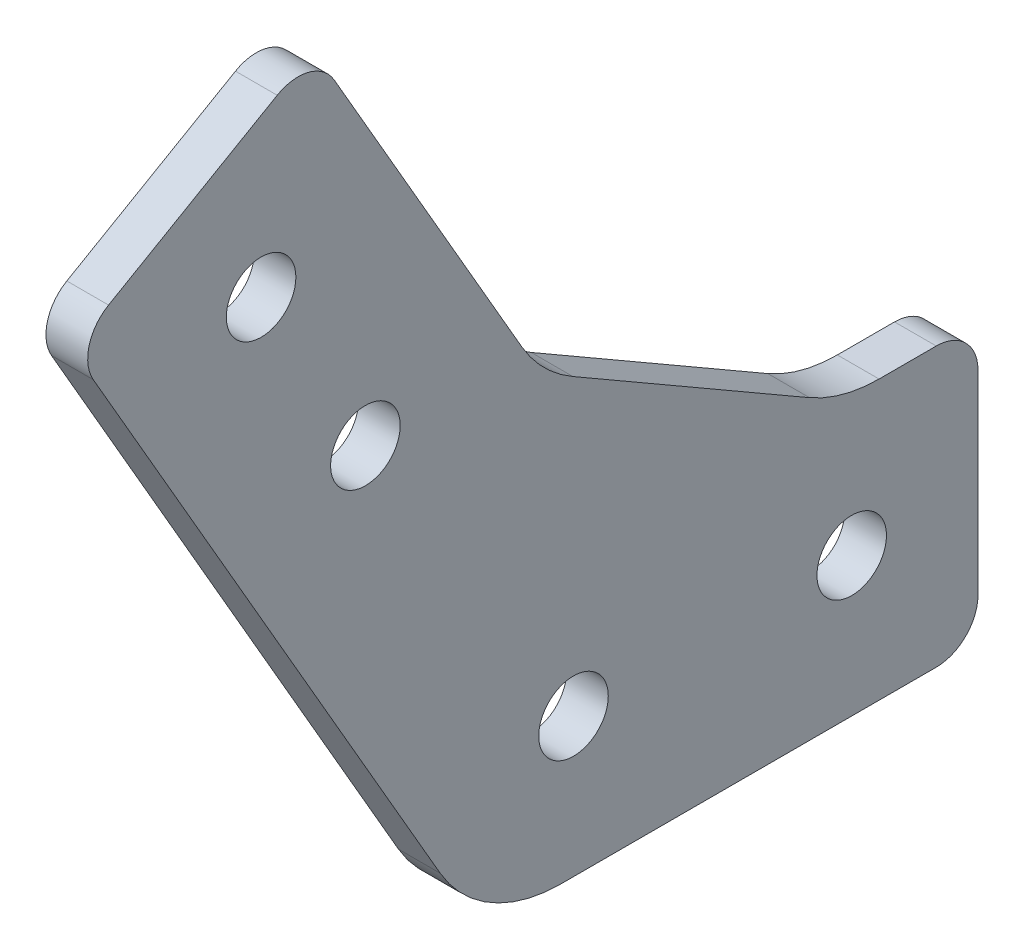
ISO-10303-21;
HEADER;
FILE_DESCRIPTION(('STEP AP214'),'2;1');
FILE_NAME('part.step','',(''),(''),'','','');
FILE_SCHEMA(('AUTOMOTIVE_DESIGN { 1 0 10303 214 1 1 1 1 }'));
ENDSEC;
DATA;
#1=APPLICATION_CONTEXT('core data for automotive mechanical design processes');
#2=APPLICATION_PROTOCOL_DEFINITION('international standard','automotive_design',2000,#1);
#3=PRODUCT_CONTEXT('',#1,'mechanical');
#4=PRODUCT('Part','Part','',(#3));
#5=PRODUCT_RELATED_PRODUCT_CATEGORY('part','',(#4));
#6=PRODUCT_DEFINITION_FORMATION('','',#4);
#7=PRODUCT_DEFINITION_CONTEXT('part definition',#1,'design');
#8=PRODUCT_DEFINITION('design','',#6,#7);
#9=PRODUCT_DEFINITION_SHAPE('','',#8);
#10=(LENGTH_UNIT() NAMED_UNIT(*) SI_UNIT(.MILLI.,.METRE.));
#11=(NAMED_UNIT(*) PLANE_ANGLE_UNIT() SI_UNIT($,.RADIAN.));
#12=(NAMED_UNIT(*) SI_UNIT($,.STERADIAN.) SOLID_ANGLE_UNIT());
#13=UNCERTAINTY_MEASURE_WITH_UNIT(LENGTH_MEASURE(1.E-05),#10,'distance_accuracy_value','');
#14=(GEOMETRIC_REPRESENTATION_CONTEXT(3) GLOBAL_UNCERTAINTY_ASSIGNED_CONTEXT((#13)) GLOBAL_UNIT_ASSIGNED_CONTEXT((#10,
#11,#12)) REPRESENTATION_CONTEXT('',''));
#15=CARTESIAN_POINT('',(0.,0.,0.));
#16=DIRECTION('',(0.,0.,1.));
#17=DIRECTION('',(1.,0.,0.));
#18=AXIS2_PLACEMENT_3D('',#15,#16,#17);
#19=CARTESIAN_POINT('',(3.,40.8012701892218,35.1036297108187));
#20=DIRECTION('',(0.,-0.866025403784436,-0.500000000000004));
#21=DIRECTION('',(0.,0.500000000000004,-0.866025403784436));
#22=AXIS2_PLACEMENT_3D('',#19,#20,#21);
#23=PLANE('',#22);
#24=DIRECTION('',(0.,-0.500000000000004,0.866025403784436));
#25=VECTOR('',#24,1.);
#26=CARTESIAN_POINT('',(0.,40.8012701892218,35.1036297108187));
#27=LINE('',#26,#25);
#28=CARTESIAN_POINT('',(0.,49.3012701892218,20.3811978464832));
#29=VERTEX_POINT('',#28);
#30=CARTESIAN_POINT('',(0.,42.3012701892218,32.5055534994654));
#31=VERTEX_POINT('',#30);
#32=EDGE_CURVE('E182',#29,#31,#27,.T.);
#33=ORIENTED_EDGE('',*,*,#32,.T.);
#34=DIRECTION('',(-1.,0.,0.));
#35=VECTOR('',#34,1.);
#36=CARTESIAN_POINT('',(3.,42.3012701892218,32.5055534994654));
#37=LINE('',#36,#35);
#38=CARTESIAN_POINT('',(3.,42.3012701892218,32.5055534994654));
#39=VERTEX_POINT('',#38);
#40=EDGE_CURVE('E229',#31,#39,#37,.F.);
#41=ORIENTED_EDGE('',*,*,#40,.T.);
#42=DIRECTION('',(0.,-0.500000000000004,0.866025403784436));
#43=VECTOR('',#42,1.);
#44=CARTESIAN_POINT('',(3.,40.8012701892218,35.1036297108187));
#45=LINE('',#44,#43);
#46=CARTESIAN_POINT('',(3.,49.3012701892218,20.3811978464832));
#47=VERTEX_POINT('',#46);
#48=EDGE_CURVE('E149',#47,#39,#45,.T.);
#49=ORIENTED_EDGE('',*,*,#48,.F.);
#50=DIRECTION('',(-1.,0.,0.));
#51=VECTOR('',#50,1.);
#52=CARTESIAN_POINT('',(3.,49.3012701892218,20.3811978464832));
#53=LINE('',#52,#51);
#54=EDGE_CURVE('E226',#47,#29,#53,.T.);
#55=ORIENTED_EDGE('',*,*,#54,.T.);
#56=EDGE_LOOP('',(#33,#41,#49,#55));
#57=FACE_BOUND('',#56,.T.);
#58=ADVANCED_FACE('F36',(#57),#23,.F.);
#59=CARTESIAN_POINT('',(3.,-5.,8.66025403784439));
#60=DIRECTION('',(0.,0.500000000000004,-0.866025403784436));
#61=DIRECTION('',(0.,0.866025403784436,0.500000000000004));
#62=AXIS2_PLACEMENT_3D('',#59,#60,#61);
#63=PLANE('',#62);
#64=DIRECTION('',(0.,-0.866025403784436,-0.500000000000004));
#65=VECTOR('',#64,1.);
#66=CARTESIAN_POINT('',(3.,-5.,8.66025403784439));
#67=LINE('',#66,#65);
#68=CARTESIAN_POINT('',(3.,38.2031939778685,33.6036297108187));
#69=VERTEX_POINT('',#68);
#70=CARTESIAN_POINT('',(3.,-5.,8.66025403784439));
#71=VERTEX_POINT('',#70);
#72=EDGE_CURVE('E136',#69,#71,#67,.T.);
#73=ORIENTED_EDGE('',*,*,#72,.F.);
#74=DIRECTION('',(-1.,0.,0.));
#75=VECTOR('',#74,1.);
#76=CARTESIAN_POINT('',(3.,38.2031939778685,33.6036297108187));
#77=LINE('',#76,#75);
#78=CARTESIAN_POINT('',(0.,38.2031939778685,33.6036297108187));
#79=VERTEX_POINT('',#78);
#80=EDGE_CURVE('E158',#69,#79,#77,.T.);
#81=ORIENTED_EDGE('',*,*,#80,.T.);
#82=DIRECTION('',(0.,-0.866025403784436,-0.500000000000004));
#83=VECTOR('',#82,1.);
#84=CARTESIAN_POINT('',(0.,-5.,8.66025403784439));
#85=LINE('',#84,#83);
#86=CARTESIAN_POINT('',(0.,-5.,8.66025403784439));
#87=VERTEX_POINT('',#86);
#88=EDGE_CURVE('E155',#79,#87,#85,.T.);
#89=ORIENTED_EDGE('',*,*,#88,.T.);
#90=DIRECTION('',(-1.,0.,0.));
#91=VECTOR('',#90,1.);
#92=CARTESIAN_POINT('',(3.,-5.,8.66025403784439));
#93=LINE('',#92,#91);
#94=EDGE_CURVE('E152',#71,#87,#93,.T.);
#95=ORIENTED_EDGE('',*,*,#94,.F.);
#96=EDGE_LOOP('',(#73,#81,#89,#95));
#97=FACE_BOUND('',#96,.T.);
#98=ADVANCED_FACE('F153',(#97),#63,.F.);
#99=CARTESIAN_POINT('',(3.,0.,0.));
#100=DIRECTION('',(-1.,0.,0.));
#101=DIRECTION('',(0.,0.,1.));
#102=AXIS2_PLACEMENT_3D('',#99,#100,#101);
#103=CYLINDRICAL_SURFACE('',#102,10.);
#104=CARTESIAN_POINT('',(0.,0.,0.));
#105=DIRECTION('',(1.,0.,0.));
#106=DIRECTION('',(0.,0.,1.));
#107=AXIS2_PLACEMENT_3D('',#104,#105,#106);
#108=CIRCLE('',#107,10.);
#109=CARTESIAN_POINT('',(0.,-10.,0.));
#110=VERTEX_POINT('',#109);
#111=EDGE_CURVE('E187',#87,#110,#108,.T.);
#112=ORIENTED_EDGE('',*,*,#111,.T.);
#113=DIRECTION('',(-1.,0.,0.));
#114=VECTOR('',#113,1.);
#115=CARTESIAN_POINT('',(3.,-10.,0.));
#116=LINE('',#115,#114);
#117=CARTESIAN_POINT('',(3.,-10.,0.));
#118=VERTEX_POINT('',#117);
#119=EDGE_CURVE('E159',#118,#110,#116,.T.);
#120=ORIENTED_EDGE('',*,*,#119,.F.);
#121=CARTESIAN_POINT('',(3.,0.,0.));
#122=DIRECTION('',(1.,0.,0.));
#123=DIRECTION('',(0.,0.,1.));
#124=AXIS2_PLACEMENT_3D('',#121,#122,#123);
#125=CIRCLE('',#124,10.);
#126=EDGE_CURVE('E142',#71,#118,#125,.T.);
#127=ORIENTED_EDGE('',*,*,#126,.F.);
#128=ORIENTED_EDGE('',*,*,#94,.T.);
#129=EDGE_LOOP('',(#112,#120,#127,#128));
#130=FACE_BOUND('',#129,.T.);
#131=ADVANCED_FACE('F161',(#130),#103,.T.);
#132=CARTESIAN_POINT('',(3.,-10.,0.));
#133=DIRECTION('',(0.,1.,0.));
#134=DIRECTION('',(0.,0.,1.));
#135=AXIS2_PLACEMENT_3D('',#132,#133,#134);
#136=PLANE('',#135);
#137=DIRECTION('',(0.,0.,-1.));
#138=VECTOR('',#137,1.);
#139=CARTESIAN_POINT('',(0.,-10.,0.));
#140=LINE('',#139,#138);
#141=CARTESIAN_POINT('',(0.,-10.,-27.));
#142=VERTEX_POINT('',#141);
#143=EDGE_CURVE('E189',#110,#142,#140,.T.);
#144=ORIENTED_EDGE('',*,*,#143,.T.);
#145=DIRECTION('',(-1.,0.,0.));
#146=VECTOR('',#145,1.);
#147=CARTESIAN_POINT('',(3.,-10.,-27.));
#148=LINE('',#147,#146);
#149=CARTESIAN_POINT('',(3.,-10.,-27.));
#150=VERTEX_POINT('',#149);
#151=EDGE_CURVE('E242',#142,#150,#148,.F.);
#152=ORIENTED_EDGE('',*,*,#151,.T.);
#153=DIRECTION('',(0.,0.,-1.));
#154=VECTOR('',#153,1.);
#155=CARTESIAN_POINT('',(3.,-10.,0.));
#156=LINE('',#155,#154);
#157=EDGE_CURVE('E164',#118,#150,#156,.T.);
#158=ORIENTED_EDGE('',*,*,#157,.F.);
#159=ORIENTED_EDGE('',*,*,#119,.T.);
#160=EDGE_LOOP('',(#144,#152,#158,#159));
#161=FACE_BOUND('',#160,.T.);
#162=ADVANCED_FACE('F315',(#161),#136,.F.);
#163=CARTESIAN_POINT('',(3.,10.,-30.));
#164=DIRECTION('',(0.,0.,1.));
#165=DIRECTION('',(0.,-1.,0.));
#166=AXIS2_PLACEMENT_3D('',#163,#164,#165);
#167=PLANE('',#166);
#168=DIRECTION('',(0.,1.,0.));
#169=VECTOR('',#168,1.);
#170=CARTESIAN_POINT('',(3.,10.,-30.));
#171=LINE('',#170,#169);
#172=CARTESIAN_POINT('',(3.,-7.,-30.));
#173=VERTEX_POINT('',#172);
#174=CARTESIAN_POINT('',(3.,7.,-30.));
#175=VERTEX_POINT('',#174);
#176=EDGE_CURVE('E166',#173,#175,#171,.T.);
#177=ORIENTED_EDGE('',*,*,#176,.F.);
#178=DIRECTION('',(-1.,0.,0.));
#179=VECTOR('',#178,1.);
#180=CARTESIAN_POINT('',(3.,-7.,-30.));
#181=LINE('',#180,#179);
#182=CARTESIAN_POINT('',(0.,-7.,-30.));
#183=VERTEX_POINT('',#182);
#184=EDGE_CURVE('E239',#173,#183,#181,.T.);
#185=ORIENTED_EDGE('',*,*,#184,.T.);
#186=DIRECTION('',(0.,1.,0.));
#187=VECTOR('',#186,1.);
#188=CARTESIAN_POINT('',(0.,10.,-30.));
#189=LINE('',#188,#187);
#190=CARTESIAN_POINT('',(0.,7.,-30.));
#191=VERTEX_POINT('',#190);
#192=EDGE_CURVE('E192',#183,#191,#189,.T.);
#193=ORIENTED_EDGE('',*,*,#192,.T.);
#194=DIRECTION('',(-1.,0.,0.));
#195=VECTOR('',#194,1.);
#196=CARTESIAN_POINT('',(3.,7.,-30.));
#197=LINE('',#196,#195);
#198=EDGE_CURVE('E237',#191,#175,#197,.F.);
#199=ORIENTED_EDGE('',*,*,#198,.T.);
#200=EDGE_LOOP('',(#177,#185,#193,#199));
#201=FACE_BOUND('',#200,.T.);
#202=ADVANCED_FACE('F309',(#201),#167,.F.);
#203=CARTESIAN_POINT('',(3.,10.,-22.886751345948));
#204=DIRECTION('',(0.,-1.,0.));
#205=DIRECTION('',(0.,0.,-1.));
#206=AXIS2_PLACEMENT_3D('',#203,#204,#205);
#207=PLANE('',#206);
#208=DIRECTION('',(0.,0.,1.));
#209=VECTOR('',#208,1.);
#210=CARTESIAN_POINT('',(3.,10.,-22.886751345948));
#211=LINE('',#210,#209);
#212=CARTESIAN_POINT('',(3.,10.,-27.));
#213=VERTEX_POINT('',#212);
#214=CARTESIAN_POINT('',(3.,10.,-22.886751345948));
#215=VERTEX_POINT('',#214);
#216=EDGE_CURVE('E171',#213,#215,#211,.T.);
#217=ORIENTED_EDGE('',*,*,#216,.F.);
#218=DIRECTION('',(-1.,0.,0.));
#219=VECTOR('',#218,1.);
#220=CARTESIAN_POINT('',(3.,10.,-27.));
#221=LINE('',#220,#219);
#222=CARTESIAN_POINT('',(0.,10.,-27.));
#223=VERTEX_POINT('',#222);
#224=EDGE_CURVE('E44',#213,#223,#221,.T.);
#225=ORIENTED_EDGE('',*,*,#224,.T.);
#226=DIRECTION('',(0.,0.,1.));
#227=VECTOR('',#226,1.);
#228=CARTESIAN_POINT('',(0.,10.,-22.886751345948));
#229=LINE('',#228,#227);
#230=CARTESIAN_POINT('',(0.,10.,-22.886751345948));
#231=VERTEX_POINT('',#230);
#232=EDGE_CURVE('E195',#223,#231,#229,.T.);
#233=ORIENTED_EDGE('',*,*,#232,.T.);
#234=DIRECTION('',(-1.,0.,0.));
#235=VECTOR('',#234,1.);
#236=CARTESIAN_POINT('',(3.,10.,-22.886751345948));
#237=LINE('',#236,#235);
#238=EDGE_CURVE('E213',#215,#231,#237,.T.);
#239=ORIENTED_EDGE('',*,*,#238,.F.);
#240=EDGE_LOOP('',(#217,#225,#233,#239));
#241=FACE_BOUND('',#240,.T.);
#242=ADVANCED_FACE('F247',(#241),#207,.F.);
#243=CARTESIAN_POINT('',(3.,20.,-22.886751345948));
#244=DIRECTION('',(-1.,0.,0.));
#245=DIRECTION('',(0.,0.,1.));
#246=AXIS2_PLACEMENT_3D('',#243,#244,#245);
#247=CYLINDRICAL_SURFACE('',#246,10.);
#248=CARTESIAN_POINT('',(0.,20.,-22.886751345948));
#249=DIRECTION('',(-1.,0.,0.));
#250=DIRECTION('',(0.,0.,1.));
#251=AXIS2_PLACEMENT_3D('',#248,#249,#250);
#252=CIRCLE('',#251,10.);
#253=CARTESIAN_POINT('',(0.,11.3397459621556,-17.8867513459479));
#254=VERTEX_POINT('',#253);
#255=EDGE_CURVE('E197',#231,#254,#252,.T.);
#256=ORIENTED_EDGE('',*,*,#255,.T.);
#257=DIRECTION('',(-1.,0.,0.));
#258=VECTOR('',#257,1.);
#259=CARTESIAN_POINT('',(3.,11.3397459621556,-17.8867513459479));
#260=LINE('',#259,#258);
#261=CARTESIAN_POINT('',(3.,11.3397459621556,-17.8867513459479));
#262=VERTEX_POINT('',#261);
#263=EDGE_CURVE('E210',#262,#254,#260,.T.);
#264=ORIENTED_EDGE('',*,*,#263,.F.);
#265=CARTESIAN_POINT('',(3.,20.,-22.886751345948));
#266=DIRECTION('',(-1.,0.,0.));
#267=DIRECTION('',(0.,0.,1.));
#268=AXIS2_PLACEMENT_3D('',#265,#266,#267);
#269=CIRCLE('',#268,10.);
#270=EDGE_CURVE('E173',#215,#262,#269,.T.);
#271=ORIENTED_EDGE('',*,*,#270,.F.);
#272=ORIENTED_EDGE('',*,*,#238,.T.);
#273=EDGE_LOOP('',(#256,#264,#271,#272));
#274=FACE_BOUND('',#273,.T.);
#275=ADVANCED_FACE('F258',(#274),#247,.F.);
#276=CARTESIAN_POINT('',(3.,21.1602540378444,-0.877132402714575));
#277=DIRECTION('',(0.,-0.866025403784438,0.500000000000001));
#278=DIRECTION('',(0.,-0.500000000000001,-0.866025403784438));
#279=AXIS2_PLACEMENT_3D('',#276,#277,#278);
#280=PLANE('',#279);
#281=DIRECTION('',(0.,0.500000000000001,0.866025403784438));
#282=VECTOR('',#281,1.);
#283=CARTESIAN_POINT('',(0.,21.1602540378444,-0.877132402714575));
#284=LINE('',#283,#282);
#285=CARTESIAN_POINT('',(0.,21.1602540378444,-0.877132402714575));
#286=VERTEX_POINT('',#285);
#287=EDGE_CURVE('E199',#254,#286,#284,.T.);
#288=ORIENTED_EDGE('',*,*,#287,.T.);
#289=DIRECTION('',(-1.,0.,0.));
#290=VECTOR('',#289,1.);
#291=CARTESIAN_POINT('',(3.,21.1602540378444,-0.877132402714575));
#292=LINE('',#291,#290);
#293=CARTESIAN_POINT('',(3.,21.1602540378444,-0.877132402714575));
#294=VERTEX_POINT('',#293);
#295=EDGE_CURVE('E207',#294,#286,#292,.T.);
#296=ORIENTED_EDGE('',*,*,#295,.F.);
#297=DIRECTION('',(0.,0.500000000000001,0.866025403784438));
#298=VECTOR('',#297,1.);
#299=CARTESIAN_POINT('',(3.,21.1602540378444,-0.877132402714575));
#300=LINE('',#299,#298);
#301=EDGE_CURVE('E175',#262,#294,#300,.T.);
#302=ORIENTED_EDGE('',*,*,#301,.F.);
#303=ORIENTED_EDGE('',*,*,#263,.T.);
#304=EDGE_LOOP('',(#288,#296,#302,#303));
#305=FACE_BOUND('',#304,.T.);
#306=ADVANCED_FACE('F262',(#305),#280,.F.);
#307=CARTESIAN_POINT('',(3.,29.8205080756888,-5.87713240271456));
#308=DIRECTION('',(-1.,0.,0.));
#309=DIRECTION('',(0.,0.,1.));
#310=AXIS2_PLACEMENT_3D('',#307,#308,#309);
#311=CYLINDRICAL_SURFACE('',#310,10.);
#312=CARTESIAN_POINT('',(0.,29.8205080756888,-5.87713240271456));
#313=DIRECTION('',(-1.,0.,0.));
#314=DIRECTION('',(0.,0.,1.));
#315=AXIS2_PLACEMENT_3D('',#312,#313,#314);
#316=CIRCLE('',#315,10.);
#317=CARTESIAN_POINT('',(0.,24.8205080756888,2.78312163512982));
#318=VERTEX_POINT('',#317);
#319=EDGE_CURVE('E201',#286,#318,#316,.T.);
#320=ORIENTED_EDGE('',*,*,#319,.T.);
#321=DIRECTION('',(-1.,0.,0.));
#322=VECTOR('',#321,1.);
#323=CARTESIAN_POINT('',(3.,24.8205080756888,2.78312163512982));
#324=LINE('',#323,#322);
#325=CARTESIAN_POINT('',(3.,24.8205080756888,2.78312163512982));
#326=VERTEX_POINT('',#325);
#327=EDGE_CURVE('E181',#326,#318,#324,.T.);
#328=ORIENTED_EDGE('',*,*,#327,.F.);
#329=CARTESIAN_POINT('',(3.,29.8205080756888,-5.87713240271456));
#330=DIRECTION('',(-1.,0.,0.));
#331=DIRECTION('',(0.,0.,1.));
#332=AXIS2_PLACEMENT_3D('',#329,#330,#331);
#333=CIRCLE('',#332,10.);
#334=EDGE_CURVE('E177',#294,#326,#333,.T.);
#335=ORIENTED_EDGE('',*,*,#334,.F.);
#336=ORIENTED_EDGE('',*,*,#295,.T.);
#337=EDGE_LOOP('',(#320,#328,#335,#336));
#338=FACE_BOUND('',#337,.T.);
#339=ADVANCED_FACE('F268',(#338),#311,.F.);
#340=CARTESIAN_POINT('',(3.,24.8205080756888,2.78312163512983));
#341=DIRECTION('',(0.,-0.500000000000004,0.866025403784436));
#342=DIRECTION('',(0.,-0.866025403784436,-0.500000000000004));
#343=AXIS2_PLACEMENT_3D('',#340,#341,#342);
#344=PLANE('',#343);
#345=DIRECTION('',(0.,0.866025403784436,0.500000000000004));
#346=VECTOR('',#345,1.);
#347=CARTESIAN_POINT('',(0.,24.8205080756888,2.78312163512983));
#348=LINE('',#347,#346);
#349=CARTESIAN_POINT('',(0.,48.2031939778686,16.2831216351299));
#350=VERTEX_POINT('',#349);
#351=EDGE_CURVE('E203',#318,#350,#348,.T.);
#352=ORIENTED_EDGE('',*,*,#351,.T.);
#353=DIRECTION('',(-1.,0.,0.));
#354=VECTOR('',#353,1.);
#355=CARTESIAN_POINT('',(3.,48.2031939778686,16.2831216351299));
#356=LINE('',#355,#354);
#357=CARTESIAN_POINT('',(3.,48.2031939778686,16.2831216351299));
#358=VERTEX_POINT('',#357);
#359=EDGE_CURVE('E11',#350,#358,#356,.F.);
#360=ORIENTED_EDGE('',*,*,#359,.T.);
#361=DIRECTION('',(0.,0.866025403784436,0.500000000000004));
#362=VECTOR('',#361,1.);
#363=CARTESIAN_POINT('',(3.,24.8205080756888,2.78312163512983));
#364=LINE('',#363,#362);
#365=EDGE_CURVE('E179',#326,#358,#364,.T.);
#366=ORIENTED_EDGE('',*,*,#365,.F.);
#367=ORIENTED_EDGE('',*,*,#327,.T.);
#368=EDGE_LOOP('',(#352,#360,#366,#367));
#369=FACE_BOUND('',#368,.T.);
#370=ADVANCED_FACE('F270',(#369),#344,.F.);
#371=CARTESIAN_POINT('',(3.,29.8205080756888,-5.87713240271456));
#372=DIRECTION('',(-1.,0.,0.));
#373=DIRECTION('',(0.,0.,1.));
#374=AXIS2_PLACEMENT_3D('',#371,#372,#373);
#375=PLANE('',#374);
#376=CARTESIAN_POINT('',(3.,0.,-20.92));
#377=DIRECTION('',(1.,0.,0.));
#378=DIRECTION('',(0.,0.,-1.));
#379=AXIS2_PLACEMENT_3D('',#376,#377,#378);
#380=CIRCLE('',#379,2.5);
#381=CARTESIAN_POINT('',(3.,0.,-23.42));
#382=VERTEX_POINT('',#381);
#383=EDGE_CURVE('E422',#382,#382,#380,.T.);
#384=ORIENTED_EDGE('',*,*,#383,.F.);
#385=EDGE_LOOP('',(#384));
#386=FACE_BOUND('',#385,.T.);
#387=CARTESIAN_POINT('',(3.,0.,-0.920000000000004));
#388=DIRECTION('',(1.,0.,0.));
#389=DIRECTION('',(0.,0.,-1.));
#390=AXIS2_PLACEMENT_3D('',#387,#388,#389);
#391=CIRCLE('',#390,2.5);
#392=CARTESIAN_POINT('',(3.,0.,-3.42));
#393=VERTEX_POINT('',#392);
#394=EDGE_CURVE('E427',#393,#393,#391,.T.);
#395=ORIENTED_EDGE('',*,*,#394,.F.);
#396=EDGE_LOOP('',(#395));
#397=FACE_BOUND('',#396,.T.);
#398=CARTESIAN_POINT('',(3.,24.32,14.0399999999999));
#399=DIRECTION('',(1.,0.,0.));
#400=DIRECTION('',(0.,0.,-1.));
#401=AXIS2_PLACEMENT_3D('',#398,#399,#400);
#402=CIRCLE('',#401,2.5);
#403=CARTESIAN_POINT('',(3.,24.32,11.5399999999999));
#404=VERTEX_POINT('',#403);
#405=EDGE_CURVE('E435',#404,#404,#402,.T.);
#406=ORIENTED_EDGE('',*,*,#405,.F.);
#407=EDGE_LOOP('',(#406));
#408=FACE_BOUND('',#407,.T.);
#409=CARTESIAN_POINT('',(3.,37.31,21.5399999999999));
#410=DIRECTION('',(1.,0.,0.));
#411=DIRECTION('',(0.,0.,-1.));
#412=AXIS2_PLACEMENT_3D('',#409,#410,#411);
#413=CIRCLE('',#412,2.5);
#414=CARTESIAN_POINT('',(3.,37.31,19.0399999999999));
#415=VERTEX_POINT('',#414);
#416=EDGE_CURVE('E441',#415,#415,#413,.T.);
#417=ORIENTED_EDGE('',*,*,#416,.F.);
#418=EDGE_LOOP('',(#417));
#419=FACE_BOUND('',#418,.T.);
#420=ORIENTED_EDGE('',*,*,#48,.T.);
#421=CARTESIAN_POINT('',(3.,39.7031939778685,31.0055534994653));
#422=DIRECTION('',(-1.,0.,0.));
#423=DIRECTION('',(0.,0.,1.));
#424=AXIS2_PLACEMENT_3D('',#421,#422,#423);
#425=CIRCLE('',#424,3.);
#426=EDGE_CURVE('E145',#39,#69,#425,.F.);
#427=ORIENTED_EDGE('',*,*,#426,.T.);
#428=ORIENTED_EDGE('',*,*,#72,.T.);
#429=ORIENTED_EDGE('',*,*,#126,.T.);
#430=ORIENTED_EDGE('',*,*,#157,.T.);
#431=CARTESIAN_POINT('',(3.,-7.,-27.));
#432=DIRECTION('',(-1.,0.,0.));
#433=DIRECTION('',(0.,0.,1.));
#434=AXIS2_PLACEMENT_3D('',#431,#432,#433);
#435=CIRCLE('',#434,3.);
#436=EDGE_CURVE('E234',#150,#173,#435,.F.);
#437=ORIENTED_EDGE('',*,*,#436,.T.);
#438=ORIENTED_EDGE('',*,*,#176,.T.);
#439=CARTESIAN_POINT('',(3.,7.,-27.));
#440=DIRECTION('',(-1.,0.,0.));
#441=DIRECTION('',(0.,0.,1.));
#442=AXIS2_PLACEMENT_3D('',#439,#440,#441);
#443=CIRCLE('',#442,3.);
#444=EDGE_CURVE('E57',#175,#213,#443,.F.);
#445=ORIENTED_EDGE('',*,*,#444,.T.);
#446=ORIENTED_EDGE('',*,*,#216,.T.);
#447=ORIENTED_EDGE('',*,*,#270,.T.);
#448=ORIENTED_EDGE('',*,*,#301,.T.);
#449=ORIENTED_EDGE('',*,*,#334,.T.);
#450=ORIENTED_EDGE('',*,*,#365,.T.);
#451=CARTESIAN_POINT('',(3.,46.7031939778685,18.8811978464832));
#452=DIRECTION('',(-1.,0.,0.));
#453=DIRECTION('',(0.,0.,1.));
#454=AXIS2_PLACEMENT_3D('',#451,#452,#453);
#455=CIRCLE('',#454,3.);
#456=EDGE_CURVE('E231',#358,#47,#455,.F.);
#457=ORIENTED_EDGE('',*,*,#456,.T.);
#458=EDGE_LOOP('',(#420,#427,#428,#429,#430,#437,#438,#445,#446,#447,#448,#449,#450,#457));
#459=FACE_BOUND('',#458,.T.);
#460=ADVANCED_FACE('F139',(#386,#397,#408,#419,#459),#375,.F.);
#461=CARTESIAN_POINT('',(0.,29.8205080756888,-5.87713240271456));
#462=DIRECTION('',(-1.,0.,0.));
#463=DIRECTION('',(0.,0.,1.));
#464=AXIS2_PLACEMENT_3D('',#461,#462,#463);
#465=PLANE('',#464);
#466=CARTESIAN_POINT('',(0.,0.,-20.92));
#467=DIRECTION('',(1.,0.,0.));
#468=DIRECTION('',(0.,0.,-1.));
#469=AXIS2_PLACEMENT_3D('',#466,#467,#468);
#470=CIRCLE('',#469,2.5);
#471=CARTESIAN_POINT('',(0.,0.,-23.42));
#472=VERTEX_POINT('',#471);
#473=EDGE_CURVE('E185',#472,#472,#470,.T.);
#474=ORIENTED_EDGE('',*,*,#473,.T.);
#475=EDGE_LOOP('',(#474));
#476=FACE_BOUND('',#475,.T.);
#477=CARTESIAN_POINT('',(0.,0.,-0.920000000000004));
#478=DIRECTION('',(1.,0.,0.));
#479=DIRECTION('',(0.,0.,-1.));
#480=AXIS2_PLACEMENT_3D('',#477,#478,#479);
#481=CIRCLE('',#480,2.5);
#482=CARTESIAN_POINT('',(0.,0.,-3.42));
#483=VERTEX_POINT('',#482);
#484=EDGE_CURVE('E423',#483,#483,#481,.T.);
#485=ORIENTED_EDGE('',*,*,#484,.T.);
#486=EDGE_LOOP('',(#485));
#487=FACE_BOUND('',#486,.T.);
#488=CARTESIAN_POINT('',(0.,24.32,14.0399999999999));
#489=DIRECTION('',(1.,0.,0.));
#490=DIRECTION('',(0.,0.,-1.));
#491=AXIS2_PLACEMENT_3D('',#488,#489,#490);
#492=CIRCLE('',#491,2.5);
#493=CARTESIAN_POINT('',(0.,24.32,11.5399999999999));
#494=VERTEX_POINT('',#493);
#495=EDGE_CURVE('E432',#494,#494,#492,.T.);
#496=ORIENTED_EDGE('',*,*,#495,.T.);
#497=EDGE_LOOP('',(#496));
#498=FACE_BOUND('',#497,.T.);
#499=CARTESIAN_POINT('',(0.,37.31,21.5399999999999));
#500=DIRECTION('',(1.,0.,0.));
#501=DIRECTION('',(0.,0.,-1.));
#502=AXIS2_PLACEMENT_3D('',#499,#500,#501);
#503=CIRCLE('',#502,2.5);
#504=CARTESIAN_POINT('',(0.,37.31,19.0399999999999));
#505=VERTEX_POINT('',#504);
#506=EDGE_CURVE('E438',#505,#505,#503,.T.);
#507=ORIENTED_EDGE('',*,*,#506,.T.);
#508=EDGE_LOOP('',(#507));
#509=FACE_BOUND('',#508,.T.);
#510=ORIENTED_EDGE('',*,*,#88,.F.);
#511=CARTESIAN_POINT('',(0.,39.7031939778685,31.0055534994653));
#512=DIRECTION('',(-1.,0.,0.));
#513=DIRECTION('',(0.,0.,1.));
#514=AXIS2_PLACEMENT_3D('',#511,#512,#513);
#515=CIRCLE('',#514,3.);
#516=EDGE_CURVE('E224',#79,#31,#515,.T.);
#517=ORIENTED_EDGE('',*,*,#516,.T.);
#518=ORIENTED_EDGE('',*,*,#32,.F.);
#519=CARTESIAN_POINT('',(0.,46.7031939778685,18.8811978464832));
#520=DIRECTION('',(-1.,0.,0.));
#521=DIRECTION('',(0.,0.,1.));
#522=AXIS2_PLACEMENT_3D('',#519,#520,#521);
#523=CIRCLE('',#522,3.);
#524=EDGE_CURVE('E218',#29,#350,#523,.T.);
#525=ORIENTED_EDGE('',*,*,#524,.T.);
#526=ORIENTED_EDGE('',*,*,#351,.F.);
#527=ORIENTED_EDGE('',*,*,#319,.F.);
#528=ORIENTED_EDGE('',*,*,#287,.F.);
#529=ORIENTED_EDGE('',*,*,#255,.F.);
#530=ORIENTED_EDGE('',*,*,#232,.F.);
#531=CARTESIAN_POINT('',(0.,7.,-27.));
#532=DIRECTION('',(-1.,0.,0.));
#533=DIRECTION('',(0.,0.,1.));
#534=AXIS2_PLACEMENT_3D('',#531,#532,#533);
#535=CIRCLE('',#534,3.);
#536=EDGE_CURVE('E220',#223,#191,#535,.T.);
#537=ORIENTED_EDGE('',*,*,#536,.T.);
#538=ORIENTED_EDGE('',*,*,#192,.F.);
#539=CARTESIAN_POINT('',(0.,-7.,-27.));
#540=DIRECTION('',(-1.,0.,0.));
#541=DIRECTION('',(0.,0.,1.));
#542=AXIS2_PLACEMENT_3D('',#539,#540,#541);
#543=CIRCLE('',#542,3.);
#544=EDGE_CURVE('E222',#183,#142,#543,.T.);
#545=ORIENTED_EDGE('',*,*,#544,.T.);
#546=ORIENTED_EDGE('',*,*,#143,.F.);
#547=ORIENTED_EDGE('',*,*,#111,.F.);
#548=EDGE_LOOP('',(#510,#517,#518,#525,#526,#527,#528,#529,#530,#537,#538,#545,#546,#547));
#549=FACE_BOUND('',#548,.T.);
#550=ADVANCED_FACE('F252',(#476,#487,#498,#509,#549),#465,.T.);
#551=CARTESIAN_POINT('',(0.,37.31,21.5399999999999));
#552=DIRECTION('',(1.,0.,0.));
#553=DIRECTION('',(0.,0.,-1.));
#554=AXIS2_PLACEMENT_3D('',#551,#552,#553);
#555=CYLINDRICAL_SURFACE('',#554,2.5);
#556=ORIENTED_EDGE('',*,*,#506,.F.);
#557=EDGE_LOOP('',(#556));
#558=FACE_BOUND('',#557,.T.);
#559=ORIENTED_EDGE('',*,*,#416,.T.);
#560=EDGE_LOOP('',(#559));
#561=FACE_BOUND('',#560,.T.);
#562=ADVANCED_FACE('F355',(#558,#561),#555,.F.);
#563=CARTESIAN_POINT('',(0.,24.32,14.0399999999999));
#564=DIRECTION('',(1.,0.,0.));
#565=DIRECTION('',(0.,0.,-1.));
#566=AXIS2_PLACEMENT_3D('',#563,#564,#565);
#567=CYLINDRICAL_SURFACE('',#566,2.5);
#568=ORIENTED_EDGE('',*,*,#495,.F.);
#569=EDGE_LOOP('',(#568));
#570=FACE_BOUND('',#569,.T.);
#571=ORIENTED_EDGE('',*,*,#405,.T.);
#572=EDGE_LOOP('',(#571));
#573=FACE_BOUND('',#572,.T.);
#574=ADVANCED_FACE('F364',(#570,#573),#567,.F.);
#575=CARTESIAN_POINT('',(0.,0.,-0.920000000000004));
#576=DIRECTION('',(1.,0.,0.));
#577=DIRECTION('',(0.,0.,-1.));
#578=AXIS2_PLACEMENT_3D('',#575,#576,#577);
#579=CYLINDRICAL_SURFACE('',#578,2.5);
#580=ORIENTED_EDGE('',*,*,#484,.F.);
#581=EDGE_LOOP('',(#580));
#582=FACE_BOUND('',#581,.T.);
#583=ORIENTED_EDGE('',*,*,#394,.T.);
#584=EDGE_LOOP('',(#583));
#585=FACE_BOUND('',#584,.T.);
#586=ADVANCED_FACE('F371',(#582,#585),#579,.F.);
#587=CARTESIAN_POINT('',(0.,0.,-20.92));
#588=DIRECTION('',(1.,0.,0.));
#589=DIRECTION('',(0.,0.,-1.));
#590=AXIS2_PLACEMENT_3D('',#587,#588,#589);
#591=CYLINDRICAL_SURFACE('',#590,2.5);
#592=ORIENTED_EDGE('',*,*,#473,.F.);
#593=EDGE_LOOP('',(#592));
#594=FACE_BOUND('',#593,.T.);
#595=ORIENTED_EDGE('',*,*,#383,.T.);
#596=EDGE_LOOP('',(#595));
#597=FACE_BOUND('',#596,.T.);
#598=ADVANCED_FACE('F296',(#594,#597),#591,.F.);
#599=CARTESIAN_POINT('',(3.,39.7031939778685,31.0055534994653));
#600=DIRECTION('',(-1.,0.,0.));
#601=DIRECTION('',(0.,0.,1.));
#602=AXIS2_PLACEMENT_3D('',#599,#600,#601);
#603=CYLINDRICAL_SURFACE('',#602,3.);
#604=ORIENTED_EDGE('',*,*,#426,.F.);
#605=ORIENTED_EDGE('',*,*,#40,.F.);
#606=ORIENTED_EDGE('',*,*,#516,.F.);
#607=ORIENTED_EDGE('',*,*,#80,.F.);
#608=EDGE_LOOP('',(#604,#605,#606,#607));
#609=FACE_BOUND('',#608,.T.);
#610=ADVANCED_FACE('F292',(#609),#603,.T.);
#611=CARTESIAN_POINT('',(3.,-7.,-27.));
#612=DIRECTION('',(-1.,0.,0.));
#613=DIRECTION('',(0.,0.,1.));
#614=AXIS2_PLACEMENT_3D('',#611,#612,#613);
#615=CYLINDRICAL_SURFACE('',#614,3.);
#616=ORIENTED_EDGE('',*,*,#436,.F.);
#617=ORIENTED_EDGE('',*,*,#151,.F.);
#618=ORIENTED_EDGE('',*,*,#544,.F.);
#619=ORIENTED_EDGE('',*,*,#184,.F.);
#620=EDGE_LOOP('',(#616,#617,#618,#619));
#621=FACE_BOUND('',#620,.T.);
#622=ADVANCED_FACE('F295',(#621),#615,.T.);
#623=CARTESIAN_POINT('',(3.,7.,-27.));
#624=DIRECTION('',(-1.,0.,0.));
#625=DIRECTION('',(0.,0.,1.));
#626=AXIS2_PLACEMENT_3D('',#623,#624,#625);
#627=CYLINDRICAL_SURFACE('',#626,3.);
#628=ORIENTED_EDGE('',*,*,#444,.F.);
#629=ORIENTED_EDGE('',*,*,#198,.F.);
#630=ORIENTED_EDGE('',*,*,#536,.F.);
#631=ORIENTED_EDGE('',*,*,#224,.F.);
#632=EDGE_LOOP('',(#628,#629,#630,#631));
#633=FACE_BOUND('',#632,.T.);
#634=ADVANCED_FACE('F299',(#633),#627,.T.);
#635=CARTESIAN_POINT('',(3.,46.7031939778685,18.8811978464832));
#636=DIRECTION('',(-1.,0.,0.));
#637=DIRECTION('',(0.,0.,1.));
#638=AXIS2_PLACEMENT_3D('',#635,#636,#637);
#639=CYLINDRICAL_SURFACE('',#638,3.);
#640=ORIENTED_EDGE('',*,*,#456,.F.);
#641=ORIENTED_EDGE('',*,*,#359,.F.);
#642=ORIENTED_EDGE('',*,*,#524,.F.);
#643=ORIENTED_EDGE('',*,*,#54,.F.);
#644=EDGE_LOOP('',(#640,#641,#642,#643));
#645=FACE_BOUND('',#644,.T.);
#646=ADVANCED_FACE('F38',(#645),#639,.T.);
#647=CLOSED_SHELL('',(#58,#98,#131,#162,#202,#242,#275,#306,#339,#370,#460,#550,#562,#574,#586,
#598,#610,#622,#634,#646));
#648=MANIFOLD_SOLID_BREP('B2',#647);
#649=ADVANCED_BREP_SHAPE_REPRESENTATION('',(#18,#648),#14);
#650=SHAPE_DEFINITION_REPRESENTATION(#9,#649);
ENDSEC;
END-ISO-10303-21;
